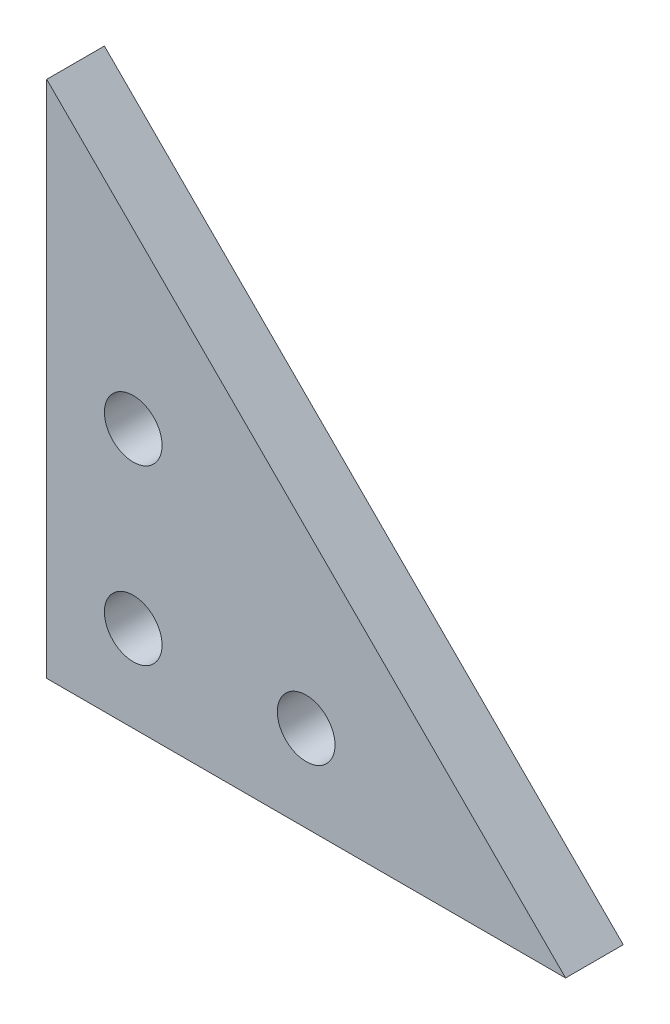
ISO-10303-21;
HEADER;
FILE_DESCRIPTION(('STEP AP214'),'2;1');
FILE_NAME('part.step','',(''),(''),'','','');
FILE_SCHEMA(('AUTOMOTIVE_DESIGN { 1 0 10303 214 1 1 1 1 }'));
ENDSEC;
DATA;
#1=APPLICATION_CONTEXT('core data for automotive mechanical design processes');
#2=APPLICATION_PROTOCOL_DEFINITION('international standard','automotive_design',2000,#1);
#3=PRODUCT_CONTEXT('',#1,'mechanical');
#4=PRODUCT('Part','Part','',(#3));
#5=PRODUCT_RELATED_PRODUCT_CATEGORY('part','',(#4));
#6=PRODUCT_DEFINITION_FORMATION('','',#4);
#7=PRODUCT_DEFINITION_CONTEXT('part definition',#1,'design');
#8=PRODUCT_DEFINITION('design','',#6,#7);
#9=PRODUCT_DEFINITION_SHAPE('','',#8);
#10=(LENGTH_UNIT() NAMED_UNIT(*) SI_UNIT(.MILLI.,.METRE.));
#11=(NAMED_UNIT(*) PLANE_ANGLE_UNIT() SI_UNIT($,.RADIAN.));
#12=(NAMED_UNIT(*) SI_UNIT($,.STERADIAN.) SOLID_ANGLE_UNIT());
#13=UNCERTAINTY_MEASURE_WITH_UNIT(LENGTH_MEASURE(1.E-05),#10,'distance_accuracy_value','');
#14=(GEOMETRIC_REPRESENTATION_CONTEXT(3) GLOBAL_UNCERTAINTY_ASSIGNED_CONTEXT((#13)) GLOBAL_UNIT_ASSIGNED_CONTEXT((#10,
#11,#12)) REPRESENTATION_CONTEXT('',''));
#15=CARTESIAN_POINT('',(0.,0.,0.));
#16=DIRECTION('',(0.,0.,1.));
#17=DIRECTION('',(1.,0.,0.));
#18=AXIS2_PLACEMENT_3D('',#15,#16,#17);
#19=CARTESIAN_POINT('',(0.,0.,3.));
#20=DIRECTION('',(0.,0.,1.));
#21=DIRECTION('',(1.,0.,0.));
#22=AXIS2_PLACEMENT_3D('',#19,#20,#21);
#23=PLANE('',#22);
#24=CARTESIAN_POINT('',(-101.443383637,83.056539338,3.));
#25=DIRECTION('',(0.,0.,1.));
#26=DIRECTION('',(1.,0.,0.));
#27=AXIS2_PLACEMENT_3D('',#24,#25,#26);
#28=CIRCLE('',#27,1.5);
#29=CARTESIAN_POINT('',(-99.943383637,83.056539338,3.));
#30=VERTEX_POINT('',#29);
#31=EDGE_CURVE('E112',#30,#30,#28,.T.);
#32=ORIENTED_EDGE('',*,*,#31,.F.);
#33=EDGE_LOOP('',(#32));
#34=FACE_BOUND('',#33,.T.);
#35=DIRECTION('',(-0.707106781186547,0.707106781186547,0.));
#36=VECTOR('',#35,1.);
#37=CARTESIAN_POINT('',(-105.943383637,105.556539338,3.));
#38=LINE('',#37,#36);
#39=CARTESIAN_POINT('',(-78.943383637,78.556539338,3.));
#40=VERTEX_POINT('',#39);
#41=CARTESIAN_POINT('',(-105.943383637,105.556539338,3.));
#42=VERTEX_POINT('',#41);
#43=EDGE_CURVE('E74',#40,#42,#38,.T.);
#44=ORIENTED_EDGE('',*,*,#43,.T.);
#45=DIRECTION('',(0.,-1.,0.));
#46=VECTOR('',#45,1.);
#47=CARTESIAN_POINT('',(-105.943383637,105.556539338,3.));
#48=LINE('',#47,#46);
#49=CARTESIAN_POINT('',(-105.943383637,78.556539338,3.));
#50=VERTEX_POINT('',#49);
#51=EDGE_CURVE('E70',#42,#50,#48,.T.);
#52=ORIENTED_EDGE('',*,*,#51,.T.);
#53=DIRECTION('',(1.,0.,0.));
#54=VECTOR('',#53,1.);
#55=CARTESIAN_POINT('',(-105.943383637,78.556539338,3.));
#56=LINE('',#55,#54);
#57=EDGE_CURVE('E50',#50,#40,#56,.T.);
#58=ORIENTED_EDGE('',*,*,#57,.T.);
#59=EDGE_LOOP('',(#44,#52,#58));
#60=FACE_BOUND('',#59,.T.);
#61=CARTESIAN_POINT('',(-101.443383637,92.056539338,3.));
#62=DIRECTION('',(0.,0.,1.));
#63=DIRECTION('',(1.,0.,0.));
#64=AXIS2_PLACEMENT_3D('',#61,#62,#63);
#65=CIRCLE('',#64,1.5);
#66=CARTESIAN_POINT('',(-99.943383637,92.056539338,3.));
#67=VERTEX_POINT('',#66);
#68=EDGE_CURVE('E84',#67,#67,#65,.T.);
#69=ORIENTED_EDGE('',*,*,#68,.F.);
#70=EDGE_LOOP('',(#69));
#71=FACE_BOUND('',#70,.T.);
#72=CARTESIAN_POINT('',(-92.443383637,83.056539338,3.));
#73=DIRECTION('',(0.,0.,1.));
#74=DIRECTION('',(1.,0.,0.));
#75=AXIS2_PLACEMENT_3D('',#72,#73,#74);
#76=CIRCLE('',#75,1.5);
#77=CARTESIAN_POINT('',(-90.943383637,83.056539338,3.));
#78=VERTEX_POINT('',#77);
#79=EDGE_CURVE('E106',#78,#78,#76,.T.);
#80=ORIENTED_EDGE('',*,*,#79,.F.);
#81=EDGE_LOOP('',(#80));
#82=FACE_BOUND('',#81,.T.);
#83=ADVANCED_FACE('F33',(#34,#60,#71,#82),#23,.T.);
#84=CARTESIAN_POINT('',(0.,0.,0.));
#85=DIRECTION('',(0.,0.,1.));
#86=DIRECTION('',(1.,0.,0.));
#87=AXIS2_PLACEMENT_3D('',#84,#85,#86);
#88=PLANE('',#87);
#89=CARTESIAN_POINT('',(-101.443383637,83.056539338,0.));
#90=DIRECTION('',(0.,0.,1.));
#91=DIRECTION('',(1.,0.,0.));
#92=AXIS2_PLACEMENT_3D('',#89,#90,#91);
#93=CIRCLE('',#92,1.5);
#94=CARTESIAN_POINT('',(-99.943383637,83.056539338,0.));
#95=VERTEX_POINT('',#94);
#96=EDGE_CURVE('E109',#95,#95,#93,.T.);
#97=ORIENTED_EDGE('',*,*,#96,.T.);
#98=EDGE_LOOP('',(#97));
#99=FACE_BOUND('',#98,.T.);
#100=DIRECTION('',(-0.707106781186547,0.707106781186547,0.));
#101=VECTOR('',#100,1.);
#102=CARTESIAN_POINT('',(-105.943383637,105.556539338,0.));
#103=LINE('',#102,#101);
#104=CARTESIAN_POINT('',(-78.943383637,78.556539338,0.));
#105=VERTEX_POINT('',#104);
#106=CARTESIAN_POINT('',(-105.943383637,105.556539338,0.));
#107=VERTEX_POINT('',#106);
#108=EDGE_CURVE('E81',#105,#107,#103,.T.);
#109=ORIENTED_EDGE('',*,*,#108,.F.);
#110=DIRECTION('',(1.,0.,0.));
#111=VECTOR('',#110,1.);
#112=CARTESIAN_POINT('',(-105.943383637,78.556539338,0.));
#113=LINE('',#112,#111);
#114=CARTESIAN_POINT('',(-105.943383637,78.556539338,0.));
#115=VERTEX_POINT('',#114);
#116=EDGE_CURVE('E67',#115,#105,#113,.T.);
#117=ORIENTED_EDGE('',*,*,#116,.F.);
#118=DIRECTION('',(0.,-1.,0.));
#119=VECTOR('',#118,1.);
#120=CARTESIAN_POINT('',(-105.943383637,105.556539338,0.));
#121=LINE('',#120,#119);
#122=EDGE_CURVE('E62',#107,#115,#121,.T.);
#123=ORIENTED_EDGE('',*,*,#122,.F.);
#124=EDGE_LOOP('',(#109,#117,#123));
#125=FACE_BOUND('',#124,.T.);
#126=CARTESIAN_POINT('',(-101.443383637,92.056539338,0.));
#127=DIRECTION('',(0.,0.,1.));
#128=DIRECTION('',(1.,0.,0.));
#129=AXIS2_PLACEMENT_3D('',#126,#127,#128);
#130=CIRCLE('',#129,1.5);
#131=CARTESIAN_POINT('',(-99.943383637,92.056539338,0.));
#132=VERTEX_POINT('',#131);
#133=EDGE_CURVE('E88',#132,#132,#130,.T.);
#134=ORIENTED_EDGE('',*,*,#133,.T.);
#135=EDGE_LOOP('',(#134));
#136=FACE_BOUND('',#135,.T.);
#137=CARTESIAN_POINT('',(-92.443383637,83.056539338,0.));
#138=DIRECTION('',(0.,0.,1.));
#139=DIRECTION('',(1.,0.,0.));
#140=AXIS2_PLACEMENT_3D('',#137,#138,#139);
#141=CIRCLE('',#140,1.5);
#142=CARTESIAN_POINT('',(-90.943383637,83.056539338,0.));
#143=VERTEX_POINT('',#142);
#144=EDGE_CURVE('E104',#143,#143,#141,.T.);
#145=ORIENTED_EDGE('',*,*,#144,.T.);
#146=EDGE_LOOP('',(#145));
#147=FACE_BOUND('',#146,.T.);
#148=ADVANCED_FACE('F94',(#99,#125,#136,#147),#88,.F.);
#149=CARTESIAN_POINT('',(-105.943383637,105.556539338,3.));
#150=DIRECTION('',(-0.707106781186548,-0.707106781186548,0.));
#151=DIRECTION('',(0.707106781186548,-0.707106781186548,0.));
#152=AXIS2_PLACEMENT_3D('',#149,#150,#151);
#153=PLANE('',#152);
#154=ORIENTED_EDGE('',*,*,#108,.T.);
#155=DIRECTION('',(0.,0.,-1.));
#156=VECTOR('',#155,1.);
#157=CARTESIAN_POINT('',(-105.943383637,105.556539338,3.));
#158=LINE('',#157,#156);
#159=EDGE_CURVE('E11',#42,#107,#158,.T.);
#160=ORIENTED_EDGE('',*,*,#159,.F.);
#161=ORIENTED_EDGE('',*,*,#43,.F.);
#162=DIRECTION('',(0.,0.,-1.));
#163=VECTOR('',#162,1.);
#164=CARTESIAN_POINT('',(-78.943383637,78.556539338,3.));
#165=LINE('',#164,#163);
#166=EDGE_CURVE('E82',#40,#105,#165,.T.);
#167=ORIENTED_EDGE('',*,*,#166,.T.);
#168=EDGE_LOOP('',(#154,#160,#161,#167));
#169=FACE_BOUND('',#168,.T.);
#170=ADVANCED_FACE('F35',(#169),#153,.F.);
#171=CARTESIAN_POINT('',(-105.943383637,105.556539338,3.));
#172=DIRECTION('',(1.,0.,0.));
#173=DIRECTION('',(0.,0.,-1.));
#174=AXIS2_PLACEMENT_3D('',#171,#172,#173);
#175=PLANE('',#174);
#176=ORIENTED_EDGE('',*,*,#122,.T.);
#177=DIRECTION('',(0.,0.,-1.));
#178=VECTOR('',#177,1.);
#179=CARTESIAN_POINT('',(-105.943383637,78.556539338,3.));
#180=LINE('',#179,#178);
#181=EDGE_CURVE('E42',#50,#115,#180,.T.);
#182=ORIENTED_EDGE('',*,*,#181,.F.);
#183=ORIENTED_EDGE('',*,*,#51,.F.);
#184=ORIENTED_EDGE('',*,*,#159,.T.);
#185=EDGE_LOOP('',(#176,#182,#183,#184));
#186=FACE_BOUND('',#185,.T.);
#187=ADVANCED_FACE('F71',(#186),#175,.F.);
#188=CARTESIAN_POINT('',(-105.943383637,78.556539338,3.));
#189=DIRECTION('',(0.,1.,0.));
#190=DIRECTION('',(0.,0.,1.));
#191=AXIS2_PLACEMENT_3D('',#188,#189,#190);
#192=PLANE('',#191);
#193=ORIENTED_EDGE('',*,*,#116,.T.);
#194=ORIENTED_EDGE('',*,*,#166,.F.);
#195=ORIENTED_EDGE('',*,*,#57,.F.);
#196=ORIENTED_EDGE('',*,*,#181,.T.);
#197=EDGE_LOOP('',(#193,#194,#195,#196));
#198=FACE_BOUND('',#197,.T.);
#199=ADVANCED_FACE('F93',(#198),#192,.F.);
#200=CARTESIAN_POINT('',(-101.443383637,92.056539338,3.));
#201=DIRECTION('',(0.,0.,-1.));
#202=DIRECTION('',(-1.,0.,0.));
#203=AXIS2_PLACEMENT_3D('',#200,#201,#202);
#204=CYLINDRICAL_SURFACE('',#203,1.5);
#205=ORIENTED_EDGE('',*,*,#68,.T.);
#206=EDGE_LOOP('',(#205));
#207=FACE_BOUND('',#206,.T.);
#208=ORIENTED_EDGE('',*,*,#133,.F.);
#209=EDGE_LOOP('',(#208));
#210=FACE_BOUND('',#209,.T.);
#211=ADVANCED_FACE('F122',(#207,#210),#204,.F.);
#212=CARTESIAN_POINT('',(-101.443383637,83.056539338,3.));
#213=DIRECTION('',(0.,0.,-1.));
#214=DIRECTION('',(-1.,0.,0.));
#215=AXIS2_PLACEMENT_3D('',#212,#213,#214);
#216=CYLINDRICAL_SURFACE('',#215,1.5);
#217=ORIENTED_EDGE('',*,*,#31,.T.);
#218=EDGE_LOOP('',(#217));
#219=FACE_BOUND('',#218,.T.);
#220=ORIENTED_EDGE('',*,*,#96,.F.);
#221=EDGE_LOOP('',(#220));
#222=FACE_BOUND('',#221,.T.);
#223=ADVANCED_FACE('F119',(#219,#222),#216,.F.);
#224=CARTESIAN_POINT('',(-92.443383637,83.056539338,3.));
#225=DIRECTION('',(0.,0.,-1.));
#226=DIRECTION('',(-1.,0.,0.));
#227=AXIS2_PLACEMENT_3D('',#224,#225,#226);
#228=CYLINDRICAL_SURFACE('',#227,1.5);
#229=ORIENTED_EDGE('',*,*,#79,.T.);
#230=EDGE_LOOP('',(#229));
#231=FACE_BOUND('',#230,.T.);
#232=ORIENTED_EDGE('',*,*,#144,.F.);
#233=EDGE_LOOP('',(#232));
#234=FACE_BOUND('',#233,.T.);
#235=ADVANCED_FACE('F121',(#231,#234),#228,.F.);
#236=CLOSED_SHELL('',(#83,#148,#170,#187,#199,#211,#223,#235));
#237=MANIFOLD_SOLID_BREP('B2',#236);
#238=ADVANCED_BREP_SHAPE_REPRESENTATION('',(#18,#237),#14);
#239=SHAPE_DEFINITION_REPRESENTATION(#9,#238);
ENDSEC;
END-ISO-10303-21;
